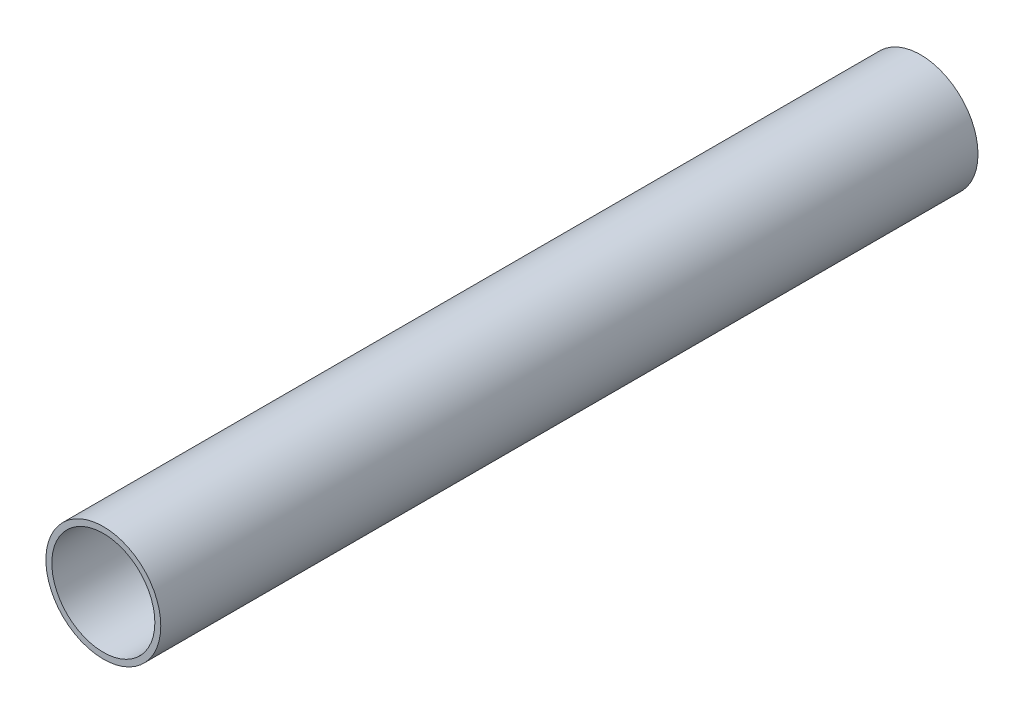
ISO-10303-21;
HEADER;
FILE_DESCRIPTION(('STEP AP214'),'2;1');
FILE_NAME('part.step','',(''),(''),'','','');
FILE_SCHEMA(('AUTOMOTIVE_DESIGN { 1 0 10303 214 1 1 1 1 }'));
ENDSEC;
DATA;
#1=APPLICATION_CONTEXT('core data for automotive mechanical design processes');
#2=APPLICATION_PROTOCOL_DEFINITION('international standard','automotive_design',2000,#1);
#3=PRODUCT_CONTEXT('',#1,'mechanical');
#4=PRODUCT('Part','Part','',(#3));
#5=PRODUCT_RELATED_PRODUCT_CATEGORY('part','',(#4));
#6=PRODUCT_DEFINITION_FORMATION('','',#4);
#7=PRODUCT_DEFINITION_CONTEXT('part definition',#1,'design');
#8=PRODUCT_DEFINITION('design','',#6,#7);
#9=PRODUCT_DEFINITION_SHAPE('','',#8);
#10=(LENGTH_UNIT() NAMED_UNIT(*) SI_UNIT(.MILLI.,.METRE.));
#11=(NAMED_UNIT(*) PLANE_ANGLE_UNIT() SI_UNIT($,.RADIAN.));
#12=(NAMED_UNIT(*) SI_UNIT($,.STERADIAN.) SOLID_ANGLE_UNIT());
#13=UNCERTAINTY_MEASURE_WITH_UNIT(LENGTH_MEASURE(1.E-05),#10,'distance_accuracy_value','');
#14=(GEOMETRIC_REPRESENTATION_CONTEXT(3) GLOBAL_UNCERTAINTY_ASSIGNED_CONTEXT((#13)) GLOBAL_UNIT_ASSIGNED_CONTEXT((#10,
#11,#12)) REPRESENTATION_CONTEXT('',''));
#15=CARTESIAN_POINT('',(0.,0.,0.));
#16=DIRECTION('',(0.,0.,1.));
#17=DIRECTION('',(1.,0.,0.));
#18=AXIS2_PLACEMENT_3D('',#15,#16,#17);
#19=CARTESIAN_POINT('',(0.,0.,-345.));
#20=DIRECTION('',(0.,0.,1.));
#21=DIRECTION('',(1.,0.,0.));
#22=AXIS2_PLACEMENT_3D('',#19,#20,#21);
#23=CYLINDRICAL_SURFACE('',#22,24.25);
#24=CARTESIAN_POINT('',(0.,0.,-345.));
#25=DIRECTION('',(0.,0.,1.));
#26=DIRECTION('',(1.,0.,0.));
#27=AXIS2_PLACEMENT_3D('',#24,#25,#26);
#28=CIRCLE('',#27,24.25);
#29=CARTESIAN_POINT('',(24.25,0.,-345.));
#30=VERTEX_POINT('',#29);
#31=EDGE_CURVE('E10',#30,#30,#28,.T.);
#32=ORIENTED_EDGE('',*,*,#31,.T.);
#33=EDGE_LOOP('',(#32));
#34=FACE_BOUND('',#33,.T.);
#35=CARTESIAN_POINT('',(0.,0.,0.));
#36=DIRECTION('',(0.,0.,1.));
#37=DIRECTION('',(1.,0.,0.));
#38=AXIS2_PLACEMENT_3D('',#35,#36,#37);
#39=CIRCLE('',#38,24.25);
#40=CARTESIAN_POINT('',(24.25,0.,0.));
#41=VERTEX_POINT('',#40);
#42=EDGE_CURVE('E37',#41,#41,#39,.T.);
#43=ORIENTED_EDGE('',*,*,#42,.F.);
#44=EDGE_LOOP('',(#43));
#45=FACE_BOUND('',#44,.T.);
#46=ADVANCED_FACE('F34',(#34,#45),#23,.T.);
#47=CARTESIAN_POINT('',(0.,0.,-345.));
#48=DIRECTION('',(0.,0.,1.));
#49=DIRECTION('',(1.,0.,0.));
#50=AXIS2_PLACEMENT_3D('',#47,#48,#49);
#51=PLANE('',#50);
#52=CARTESIAN_POINT('',(0.,0.,-345.));
#53=DIRECTION('',(0.,0.,1.));
#54=DIRECTION('',(1.,0.,0.));
#55=AXIS2_PLACEMENT_3D('',#52,#53,#54);
#56=CIRCLE('',#55,21.75);
#57=CARTESIAN_POINT('',(21.75,0.,-345.));
#58=VERTEX_POINT('',#57);
#59=EDGE_CURVE('E44',#58,#58,#56,.T.);
#60=ORIENTED_EDGE('',*,*,#59,.T.);
#61=EDGE_LOOP('',(#60));
#62=FACE_BOUND('',#61,.T.);
#63=ORIENTED_EDGE('',*,*,#31,.F.);
#64=EDGE_LOOP('',(#63));
#65=FACE_BOUND('',#64,.T.);
#66=ADVANCED_FACE('F52',(#62,#65),#51,.F.);
#67=CARTESIAN_POINT('',(0.,0.,0.));
#68=DIRECTION('',(0.,0.,1.));
#69=DIRECTION('',(1.,0.,0.));
#70=AXIS2_PLACEMENT_3D('',#67,#68,#69);
#71=PLANE('',#70);
#72=CARTESIAN_POINT('',(0.,0.,0.));
#73=DIRECTION('',(0.,0.,1.));
#74=DIRECTION('',(1.,0.,0.));
#75=AXIS2_PLACEMENT_3D('',#72,#73,#74);
#76=CIRCLE('',#75,21.75);
#77=CARTESIAN_POINT('',(21.75,0.,0.));
#78=VERTEX_POINT('',#77);
#79=EDGE_CURVE('E46',#78,#78,#76,.T.);
#80=ORIENTED_EDGE('',*,*,#79,.F.);
#81=EDGE_LOOP('',(#80));
#82=FACE_BOUND('',#81,.T.);
#83=ORIENTED_EDGE('',*,*,#42,.T.);
#84=EDGE_LOOP('',(#83));
#85=FACE_BOUND('',#84,.T.);
#86=ADVANCED_FACE('F58',(#82,#85),#71,.T.);
#87=CARTESIAN_POINT('',(0.,0.,-345.));
#88=DIRECTION('',(0.,0.,1.));
#89=DIRECTION('',(1.,0.,0.));
#90=AXIS2_PLACEMENT_3D('',#87,#88,#89);
#91=CYLINDRICAL_SURFACE('',#90,21.75);
#92=ORIENTED_EDGE('',*,*,#59,.F.);
#93=EDGE_LOOP('',(#92));
#94=FACE_BOUND('',#93,.T.);
#95=ORIENTED_EDGE('',*,*,#79,.T.);
#96=EDGE_LOOP('',(#95));
#97=FACE_BOUND('',#96,.T.);
#98=ADVANCED_FACE('F55',(#94,#97),#91,.F.);
#99=CLOSED_SHELL('',(#46,#66,#86,#98));
#100=MANIFOLD_SOLID_BREP('B2',#99);
#101=ADVANCED_BREP_SHAPE_REPRESENTATION('',(#18,#100),#14);
#102=SHAPE_DEFINITION_REPRESENTATION(#9,#101);
ENDSEC;
END-ISO-10303-21;
